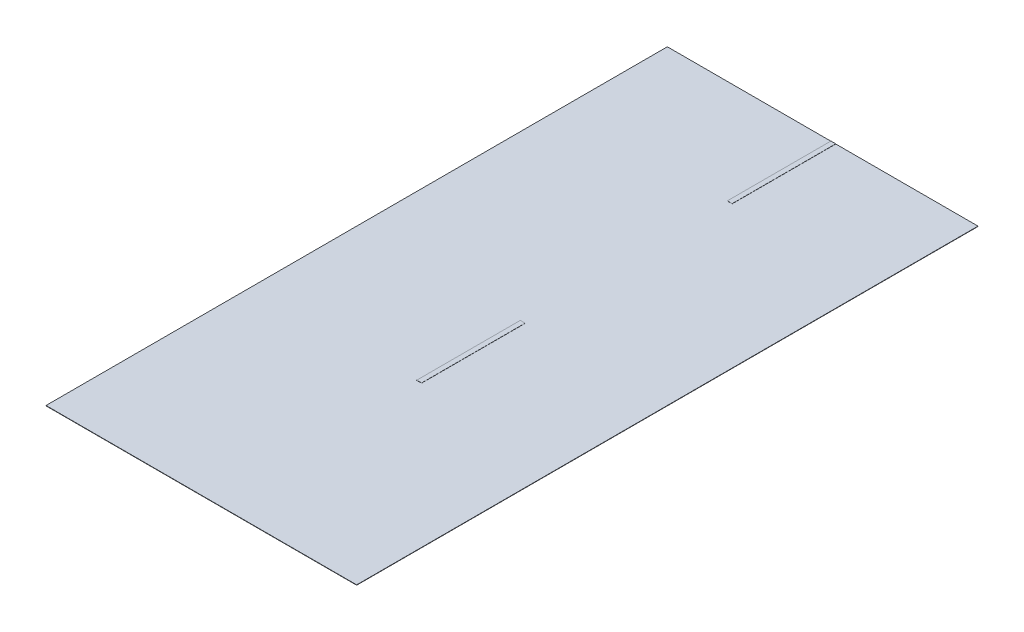
ISO-10303-21;
HEADER;
FILE_DESCRIPTION(('STEP AP214'),'2;1');
FILE_NAME('part.step','',(''),(''),'','','');
FILE_SCHEMA(('AUTOMOTIVE_DESIGN { 1 0 10303 214 1 1 1 1 }'));
ENDSEC;
DATA;
#1=APPLICATION_CONTEXT('core data for automotive mechanical design processes');
#2=APPLICATION_PROTOCOL_DEFINITION('international standard','automotive_design',2000,#1);
#3=PRODUCT_CONTEXT('',#1,'mechanical');
#4=PRODUCT('Part','Part','',(#3));
#5=PRODUCT_RELATED_PRODUCT_CATEGORY('part','',(#4));
#6=PRODUCT_DEFINITION_FORMATION('','',#4);
#7=PRODUCT_DEFINITION_CONTEXT('part definition',#1,'design');
#8=PRODUCT_DEFINITION('design','',#6,#7);
#9=PRODUCT_DEFINITION_SHAPE('','',#8);
#10=(LENGTH_UNIT() NAMED_UNIT(*) SI_UNIT(.MILLI.,.METRE.));
#11=(NAMED_UNIT(*) PLANE_ANGLE_UNIT() SI_UNIT($,.RADIAN.));
#12=(NAMED_UNIT(*) SI_UNIT($,.STERADIAN.) SOLID_ANGLE_UNIT());
#13=UNCERTAINTY_MEASURE_WITH_UNIT(LENGTH_MEASURE(1.E-05),#10,'distance_accuracy_value','');
#14=(GEOMETRIC_REPRESENTATION_CONTEXT(3) GLOBAL_UNCERTAINTY_ASSIGNED_CONTEXT((#13)) GLOBAL_UNIT_ASSIGNED_CONTEXT((#10,
#11,#12)) REPRESENTATION_CONTEXT('',''));
#15=CARTESIAN_POINT('',(0.,0.,0.));
#16=DIRECTION('',(0.,0.,1.));
#17=DIRECTION('',(1.,0.,0.));
#18=AXIS2_PLACEMENT_3D('',#15,#16,#17);
#19=CARTESIAN_POINT('',(-4572.,10.,18288.));
#20=DIRECTION('',(0.,0.,-1.));
#21=DIRECTION('',(-1.,0.,0.));
#22=AXIS2_PLACEMENT_3D('',#19,#20,#21);
#23=PLANE('',#22);
#24=DIRECTION('',(1.,0.,0.));
#25=VECTOR('',#24,1.);
#26=CARTESIAN_POINT('',(-4572.,0.,18288.));
#27=LINE('',#26,#25);
#28=CARTESIAN_POINT('',(-4572.,0.,18288.));
#29=VERTEX_POINT('',#28);
#30=CARTESIAN_POINT('',(4572.,0.,18288.));
#31=VERTEX_POINT('',#30);
#32=EDGE_CURVE('E143',#29,#31,#27,.T.);
#33=ORIENTED_EDGE('',*,*,#32,.T.);
#34=DIRECTION('',(0.,-1.,0.));
#35=VECTOR('',#34,1.);
#36=CARTESIAN_POINT('',(4572.,10.,18288.));
#37=LINE('',#36,#35);
#38=CARTESIAN_POINT('',(4572.,10.,18288.));
#39=VERTEX_POINT('',#38);
#40=EDGE_CURVE('E11',#39,#31,#37,.T.);
#41=ORIENTED_EDGE('',*,*,#40,.F.);
#42=DIRECTION('',(1.,0.,0.));
#43=VECTOR('',#42,1.);
#44=CARTESIAN_POINT('',(-4572.,10.,18288.));
#45=LINE('',#44,#43);
#46=CARTESIAN_POINT('',(-4572.,10.,18288.));
#47=VERTEX_POINT('',#46);
#48=EDGE_CURVE('E204',#47,#39,#45,.T.);
#49=ORIENTED_EDGE('',*,*,#48,.F.);
#50=DIRECTION('',(0.,-1.,0.));
#51=VECTOR('',#50,1.);
#52=CARTESIAN_POINT('',(-4572.,10.,18288.));
#53=LINE('',#52,#51);
#54=EDGE_CURVE('E215',#47,#29,#53,.T.);
#55=ORIENTED_EDGE('',*,*,#54,.T.);
#56=EDGE_LOOP('',(#33,#41,#49,#55));
#57=FACE_BOUND('',#56,.T.);
#58=ADVANCED_FACE('F47',(#57),#23,.F.);
#59=CARTESIAN_POINT('',(4572.,10.,0.));
#60=DIRECTION('',(-1.,0.,0.));
#61=DIRECTION('',(0.,0.,1.));
#62=AXIS2_PLACEMENT_3D('',#59,#60,#61);
#63=PLANE('',#62);
#64=DIRECTION('',(0.,0.,-1.));
#65=VECTOR('',#64,1.);
#66=CARTESIAN_POINT('',(4572.,0.,0.));
#67=LINE('',#66,#65);
#68=CARTESIAN_POINT('',(4572.,0.,0.));
#69=VERTEX_POINT('',#68);
#70=EDGE_CURVE('E218',#31,#69,#67,.T.);
#71=ORIENTED_EDGE('',*,*,#70,.T.);
#72=DIRECTION('',(0.,-1.,0.));
#73=VECTOR('',#72,1.);
#74=CARTESIAN_POINT('',(4572.,10.,0.));
#75=LINE('',#74,#73);
#76=CARTESIAN_POINT('',(4572.,10.,0.));
#77=VERTEX_POINT('',#76);
#78=EDGE_CURVE('E54',#77,#69,#75,.T.);
#79=ORIENTED_EDGE('',*,*,#78,.F.);
#80=DIRECTION('',(0.,0.,-1.));
#81=VECTOR('',#80,1.);
#82=CARTESIAN_POINT('',(4572.,10.,0.));
#83=LINE('',#82,#81);
#84=EDGE_CURVE('E207',#39,#77,#83,.T.);
#85=ORIENTED_EDGE('',*,*,#84,.F.);
#86=ORIENTED_EDGE('',*,*,#40,.T.);
#87=EDGE_LOOP('',(#71,#79,#85,#86));
#88=FACE_BOUND('',#87,.T.);
#89=ADVANCED_FACE('F271',(#88),#63,.F.);
#90=CARTESIAN_POINT('',(-4572.,10.,0.));
#91=DIRECTION('',(0.,0.,1.));
#92=DIRECTION('',(1.,0.,0.));
#93=AXIS2_PLACEMENT_3D('',#90,#91,#92);
#94=PLANE('',#93);
#95=DIRECTION('',(-1.,0.,0.));
#96=VECTOR('',#95,1.);
#97=CARTESIAN_POINT('',(-4572.,0.,0.));
#98=LINE('',#97,#96);
#99=CARTESIAN_POINT('',(-4572.,0.,0.));
#100=VERTEX_POINT('',#99);
#101=EDGE_CURVE('E220',#69,#100,#98,.T.);
#102=ORIENTED_EDGE('',*,*,#101,.T.);
#103=DIRECTION('',(0.,-1.,0.));
#104=VECTOR('',#103,1.);
#105=CARTESIAN_POINT('',(-4572.,10.,0.));
#106=LINE('',#105,#104);
#107=CARTESIAN_POINT('',(-4572.,10.,0.));
#108=VERTEX_POINT('',#107);
#109=EDGE_CURVE('E225',#108,#100,#106,.T.);
#110=ORIENTED_EDGE('',*,*,#109,.F.);
#111=DIRECTION('',(-1.,0.,0.));
#112=VECTOR('',#111,1.);
#113=CARTESIAN_POINT('',(-4572.,10.,0.));
#114=LINE('',#113,#112);
#115=CARTESIAN_POINT('',(243.635612114678,10.,0.));
#116=VERTEX_POINT('',#115);
#117=EDGE_CURVE('E210',#116,#108,#114,.T.);
#118=ORIENTED_EDGE('',*,*,#117,.F.);
#119=DIRECTION('',(0.,-1.,0.));
#120=VECTOR('',#119,1.);
#121=CARTESIAN_POINT('',(243.635612114678,15.,0.));
#122=LINE('',#121,#120);
#123=CARTESIAN_POINT('',(243.635612114678,15.,0.));
#124=VERTEX_POINT('',#123);
#125=EDGE_CURVE('E165',#124,#116,#122,.T.);
#126=ORIENTED_EDGE('',*,*,#125,.F.);
#127=DIRECTION('',(-1.,0.,0.));
#128=VECTOR('',#127,1.);
#129=CARTESIAN_POINT('',(0.,15.,0.));
#130=LINE('',#129,#128);
#131=CARTESIAN_POINT('',(386.035612114678,15.,0.));
#132=VERTEX_POINT('',#131);
#133=EDGE_CURVE('E177',#132,#124,#130,.T.);
#134=ORIENTED_EDGE('',*,*,#133,.F.);
#135=DIRECTION('',(0.,-1.,0.));
#136=VECTOR('',#135,1.);
#137=CARTESIAN_POINT('',(386.035612114678,15.,0.));
#138=LINE('',#137,#136);
#139=CARTESIAN_POINT('',(386.035612114679,10.,0.));
#140=VERTEX_POINT('',#139);
#141=EDGE_CURVE('E187',#132,#140,#138,.T.);
#142=ORIENTED_EDGE('',*,*,#141,.T.);
#143=EDGE_CURVE('E211',#77,#140,#114,.T.);
#144=ORIENTED_EDGE('',*,*,#143,.F.);
#145=ORIENTED_EDGE('',*,*,#78,.T.);
#146=EDGE_LOOP('',(#102,#110,#118,#126,#134,#142,#144,#145));
#147=FACE_BOUND('',#146,.T.);
#148=ADVANCED_FACE('F232',(#147),#94,.F.);
#149=CARTESIAN_POINT('',(-4572.,10.,0.));
#150=DIRECTION('',(1.,0.,0.));
#151=DIRECTION('',(0.,0.,-1.));
#152=AXIS2_PLACEMENT_3D('',#149,#150,#151);
#153=PLANE('',#152);
#154=DIRECTION('',(0.,0.,1.));
#155=VECTOR('',#154,1.);
#156=CARTESIAN_POINT('',(-4572.,0.,0.));
#157=LINE('',#156,#155);
#158=EDGE_CURVE('E208',#100,#29,#157,.T.);
#159=ORIENTED_EDGE('',*,*,#158,.T.);
#160=ORIENTED_EDGE('',*,*,#54,.F.);
#161=DIRECTION('',(0.,0.,1.));
#162=VECTOR('',#161,1.);
#163=CARTESIAN_POINT('',(-4572.,10.,0.));
#164=LINE('',#163,#162);
#165=EDGE_CURVE('E213',#108,#47,#164,.T.);
#166=ORIENTED_EDGE('',*,*,#165,.F.);
#167=ORIENTED_EDGE('',*,*,#109,.T.);
#168=EDGE_LOOP('',(#159,#160,#166,#167));
#169=FACE_BOUND('',#168,.T.);
#170=ADVANCED_FACE('F241',(#169),#153,.F.);
#171=CARTESIAN_POINT('',(0.,10.,0.));
#172=DIRECTION('',(0.,-1.,0.));
#173=DIRECTION('',(0.,0.,-1.));
#174=AXIS2_PLACEMENT_3D('',#171,#172,#173);
#175=PLANE('',#174);
#176=DIRECTION('',(1.,0.,0.));
#177=VECTOR('',#176,1.);
#178=CARTESIAN_POINT('',(0.,10.,9144.));
#179=LINE('',#178,#177);
#180=CARTESIAN_POINT('',(243.635612114773,10.,9144.));
#181=VERTEX_POINT('',#180);
#182=CARTESIAN_POINT('',(386.035612114774,10.,9144.));
#183=VERTEX_POINT('',#182);
#184=EDGE_CURVE('E69',#181,#183,#179,.T.);
#185=ORIENTED_EDGE('',*,*,#184,.T.);
#186=DIRECTION('',(0.,0.,1.));
#187=VECTOR('',#186,1.);
#188=CARTESIAN_POINT('',(386.035612114772,10.,0.));
#189=LINE('',#188,#187);
#190=CARTESIAN_POINT('',(386.035612114774,10.,12192.));
#191=VERTEX_POINT('',#190);
#192=EDGE_CURVE('E140',#183,#191,#189,.T.);
#193=ORIENTED_EDGE('',*,*,#192,.T.);
#194=DIRECTION('',(1.,0.,0.));
#195=VECTOR('',#194,1.);
#196=CARTESIAN_POINT('',(0.,10.,12192.));
#197=LINE('',#196,#195);
#198=CARTESIAN_POINT('',(243.635612114774,10.,12192.));
#199=VERTEX_POINT('',#198);
#200=EDGE_CURVE('E153',#199,#191,#197,.T.);
#201=ORIENTED_EDGE('',*,*,#200,.F.);
#202=DIRECTION('',(0.,0.,1.));
#203=VECTOR('',#202,1.);
#204=CARTESIAN_POINT('',(243.635612114772,10.,0.));
#205=LINE('',#204,#203);
#206=EDGE_CURVE('E167',#181,#199,#205,.T.);
#207=ORIENTED_EDGE('',*,*,#206,.F.);
#208=EDGE_LOOP('',(#185,#193,#201,#207));
#209=FACE_BOUND('',#208,.T.);
#210=ORIENTED_EDGE('',*,*,#143,.T.);
#211=DIRECTION('',(0.,0.,1.));
#212=VECTOR('',#211,1.);
#213=CARTESIAN_POINT('',(386.035612114678,10.,0.));
#214=LINE('',#213,#212);
#215=CARTESIAN_POINT('',(386.035612114679,10.,3048.));
#216=VERTEX_POINT('',#215);
#217=EDGE_CURVE('E61',#140,#216,#214,.T.);
#218=ORIENTED_EDGE('',*,*,#217,.T.);
#219=DIRECTION('',(1.,0.,0.));
#220=VECTOR('',#219,1.);
#221=CARTESIAN_POINT('',(0.,10.,3048.));
#222=LINE('',#221,#220);
#223=CARTESIAN_POINT('',(243.635612114678,10.,3048.));
#224=VERTEX_POINT('',#223);
#225=EDGE_CURVE('E191',#224,#216,#222,.T.);
#226=ORIENTED_EDGE('',*,*,#225,.F.);
#227=DIRECTION('',(0.,0.,1.));
#228=VECTOR('',#227,1.);
#229=CARTESIAN_POINT('',(243.635612114678,10.,0.));
#230=LINE('',#229,#228);
#231=EDGE_CURVE('E188',#116,#224,#230,.T.);
#232=ORIENTED_EDGE('',*,*,#231,.F.);
#233=ORIENTED_EDGE('',*,*,#117,.T.);
#234=ORIENTED_EDGE('',*,*,#165,.T.);
#235=ORIENTED_EDGE('',*,*,#48,.T.);
#236=ORIENTED_EDGE('',*,*,#84,.T.);
#237=EDGE_LOOP('',(#210,#218,#226,#232,#233,#234,#235,#236));
#238=FACE_BOUND('',#237,.T.);
#239=ADVANCED_FACE('F246',(#209,#238),#175,.F.);
#240=CARTESIAN_POINT('',(0.,0.,0.));
#241=DIRECTION('',(0.,-1.,0.));
#242=DIRECTION('',(0.,0.,-1.));
#243=AXIS2_PLACEMENT_3D('',#240,#241,#242);
#244=PLANE('',#243);
#245=ORIENTED_EDGE('',*,*,#32,.F.);
#246=ORIENTED_EDGE('',*,*,#158,.F.);
#247=ORIENTED_EDGE('',*,*,#101,.F.);
#248=ORIENTED_EDGE('',*,*,#70,.F.);
#249=EDGE_LOOP('',(#245,#246,#247,#248));
#250=FACE_BOUND('',#249,.T.);
#251=ADVANCED_FACE('F238',(#250),#244,.T.);
#252=CARTESIAN_POINT('',(386.035612114772,15.,0.));
#253=DIRECTION('',(1.,0.,0.));
#254=DIRECTION('',(0.,0.,-1.));
#255=AXIS2_PLACEMENT_3D('',#252,#253,#254);
#256=PLANE('',#255);
#257=ORIENTED_EDGE('',*,*,#192,.F.);
#258=DIRECTION('',(0.,-1.,0.));
#259=VECTOR('',#258,1.);
#260=CARTESIAN_POINT('',(386.035612114774,15.,9144.));
#261=LINE('',#260,#259);
#262=CARTESIAN_POINT('',(386.035612114774,15.,9144.));
#263=VERTEX_POINT('',#262);
#264=EDGE_CURVE('E135',#263,#183,#261,.T.);
#265=ORIENTED_EDGE('',*,*,#264,.F.);
#266=DIRECTION('',(0.,0.,1.));
#267=VECTOR('',#266,1.);
#268=CARTESIAN_POINT('',(386.035612114772,15.,0.));
#269=LINE('',#268,#267);
#270=CARTESIAN_POINT('',(386.035612114774,15.,12192.));
#271=VERTEX_POINT('',#270);
#272=EDGE_CURVE('E139',#263,#271,#269,.T.);
#273=ORIENTED_EDGE('',*,*,#272,.T.);
#274=DIRECTION('',(0.,-1.,0.));
#275=VECTOR('',#274,1.);
#276=CARTESIAN_POINT('',(386.035612114774,15.,12192.));
#277=LINE('',#276,#275);
#278=EDGE_CURVE('E163',#271,#191,#277,.T.);
#279=ORIENTED_EDGE('',*,*,#278,.T.);
#280=EDGE_LOOP('',(#257,#265,#273,#279));
#281=FACE_BOUND('',#280,.T.);
#282=ADVANCED_FACE('F137',(#281),#256,.T.);
#283=CARTESIAN_POINT('',(0.,15.,9144.));
#284=DIRECTION('',(0.,0.,-1.));
#285=DIRECTION('',(-1.,0.,0.));
#286=AXIS2_PLACEMENT_3D('',#283,#284,#285);
#287=PLANE('',#286);
#288=ORIENTED_EDGE('',*,*,#184,.F.);
#289=DIRECTION('',(0.,-1.,0.));
#290=VECTOR('',#289,1.);
#291=CARTESIAN_POINT('',(243.635612114773,15.,9144.));
#292=LINE('',#291,#290);
#293=CARTESIAN_POINT('',(243.635612114773,15.,9144.));
#294=VERTEX_POINT('',#293);
#295=EDGE_CURVE('E144',#294,#181,#292,.T.);
#296=ORIENTED_EDGE('',*,*,#295,.F.);
#297=DIRECTION('',(1.,0.,0.));
#298=VECTOR('',#297,1.);
#299=CARTESIAN_POINT('',(0.,15.,9144.));
#300=LINE('',#299,#298);
#301=EDGE_CURVE('E149',#294,#263,#300,.T.);
#302=ORIENTED_EDGE('',*,*,#301,.T.);
#303=ORIENTED_EDGE('',*,*,#264,.T.);
#304=EDGE_LOOP('',(#288,#296,#302,#303));
#305=FACE_BOUND('',#304,.T.);
#306=ADVANCED_FACE('F155',(#305),#287,.T.);
#307=CARTESIAN_POINT('',(243.635612114772,15.,0.));
#308=DIRECTION('',(1.,0.,0.));
#309=DIRECTION('',(0.,0.,-1.));
#310=AXIS2_PLACEMENT_3D('',#307,#308,#309);
#311=PLANE('',#310);
#312=ORIENTED_EDGE('',*,*,#206,.T.);
#313=DIRECTION('',(0.,-1.,0.));
#314=VECTOR('',#313,1.);
#315=CARTESIAN_POINT('',(243.635612114774,15.,12192.));
#316=LINE('',#315,#314);
#317=CARTESIAN_POINT('',(243.635612114774,15.,12192.));
#318=VERTEX_POINT('',#317);
#319=EDGE_CURVE('E173',#318,#199,#316,.T.);
#320=ORIENTED_EDGE('',*,*,#319,.F.);
#321=DIRECTION('',(0.,0.,1.));
#322=VECTOR('',#321,1.);
#323=CARTESIAN_POINT('',(243.635612114772,15.,0.));
#324=LINE('',#323,#322);
#325=EDGE_CURVE('E158',#294,#318,#324,.T.);
#326=ORIENTED_EDGE('',*,*,#325,.F.);
#327=ORIENTED_EDGE('',*,*,#295,.T.);
#328=EDGE_LOOP('',(#312,#320,#326,#327));
#329=FACE_BOUND('',#328,.T.);
#330=ADVANCED_FACE('F306',(#329),#311,.F.);
#331=CARTESIAN_POINT('',(0.,15.,12192.));
#332=DIRECTION('',(0.,0.,-1.));
#333=DIRECTION('',(-1.,0.,0.));
#334=AXIS2_PLACEMENT_3D('',#331,#332,#333);
#335=PLANE('',#334);
#336=ORIENTED_EDGE('',*,*,#200,.T.);
#337=ORIENTED_EDGE('',*,*,#278,.F.);
#338=DIRECTION('',(1.,0.,0.));
#339=VECTOR('',#338,1.);
#340=CARTESIAN_POINT('',(0.,15.,12192.));
#341=LINE('',#340,#339);
#342=EDGE_CURVE('E151',#318,#271,#341,.T.);
#343=ORIENTED_EDGE('',*,*,#342,.F.);
#344=ORIENTED_EDGE('',*,*,#319,.T.);
#345=EDGE_LOOP('',(#336,#337,#343,#344));
#346=FACE_BOUND('',#345,.T.);
#347=ADVANCED_FACE('F313',(#346),#335,.F.);
#348=CARTESIAN_POINT('',(0.,15.,0.));
#349=DIRECTION('',(0.,1.,0.));
#350=DIRECTION('',(0.,0.,1.));
#351=AXIS2_PLACEMENT_3D('',#348,#349,#350);
#352=PLANE('',#351);
#353=ORIENTED_EDGE('',*,*,#272,.F.);
#354=ORIENTED_EDGE('',*,*,#301,.F.);
#355=ORIENTED_EDGE('',*,*,#325,.T.);
#356=ORIENTED_EDGE('',*,*,#342,.T.);
#357=EDGE_LOOP('',(#353,#354,#355,#356));
#358=FACE_BOUND('',#357,.T.);
#359=ADVANCED_FACE('F148',(#358),#352,.T.);
#360=CARTESIAN_POINT('',(243.635612114678,15.,0.));
#361=DIRECTION('',(1.,0.,0.));
#362=DIRECTION('',(0.,0.,-1.));
#363=AXIS2_PLACEMENT_3D('',#360,#361,#362);
#364=PLANE('',#363);
#365=ORIENTED_EDGE('',*,*,#231,.T.);
#366=DIRECTION('',(0.,-1.,0.));
#367=VECTOR('',#366,1.);
#368=CARTESIAN_POINT('',(243.635612114678,15.,3048.));
#369=LINE('',#368,#367);
#370=CARTESIAN_POINT('',(243.635612114678,15.,3048.));
#371=VERTEX_POINT('',#370);
#372=EDGE_CURVE('E199',#371,#224,#369,.T.);
#373=ORIENTED_EDGE('',*,*,#372,.F.);
#374=DIRECTION('',(0.,0.,1.));
#375=VECTOR('',#374,1.);
#376=CARTESIAN_POINT('',(243.635612114678,15.,0.));
#377=LINE('',#376,#375);
#378=EDGE_CURVE('E180',#124,#371,#377,.T.);
#379=ORIENTED_EDGE('',*,*,#378,.F.);
#380=ORIENTED_EDGE('',*,*,#125,.T.);
#381=EDGE_LOOP('',(#365,#373,#379,#380));
#382=FACE_BOUND('',#381,.T.);
#383=ADVANCED_FACE('F251',(#382),#364,.F.);
#384=CARTESIAN_POINT('',(0.,15.,3048.));
#385=DIRECTION('',(0.,0.,-1.));
#386=DIRECTION('',(-1.,0.,0.));
#387=AXIS2_PLACEMENT_3D('',#384,#385,#386);
#388=PLANE('',#387);
#389=ORIENTED_EDGE('',*,*,#225,.T.);
#390=DIRECTION('',(0.,-1.,0.));
#391=VECTOR('',#390,1.);
#392=CARTESIAN_POINT('',(386.035612114679,15.,3048.));
#393=LINE('',#392,#391);
#394=CARTESIAN_POINT('',(386.035612114679,15.,3048.));
#395=VERTEX_POINT('',#394);
#396=EDGE_CURVE('E197',#395,#216,#393,.T.);
#397=ORIENTED_EDGE('',*,*,#396,.F.);
#398=DIRECTION('',(1.,0.,0.));
#399=VECTOR('',#398,1.);
#400=CARTESIAN_POINT('',(0.,15.,3048.));
#401=LINE('',#400,#399);
#402=EDGE_CURVE('E182',#371,#395,#401,.T.);
#403=ORIENTED_EDGE('',*,*,#402,.F.);
#404=ORIENTED_EDGE('',*,*,#372,.T.);
#405=EDGE_LOOP('',(#389,#397,#403,#404));
#406=FACE_BOUND('',#405,.T.);
#407=ADVANCED_FACE('F261',(#406),#388,.F.);
#408=CARTESIAN_POINT('',(386.035612114678,15.,0.));
#409=DIRECTION('',(1.,0.,0.));
#410=DIRECTION('',(0.,0.,-1.));
#411=AXIS2_PLACEMENT_3D('',#408,#409,#410);
#412=PLANE('',#411);
#413=ORIENTED_EDGE('',*,*,#217,.F.);
#414=ORIENTED_EDGE('',*,*,#141,.F.);
#415=DIRECTION('',(0.,0.,1.));
#416=VECTOR('',#415,1.);
#417=CARTESIAN_POINT('',(386.035612114678,15.,0.));
#418=LINE('',#417,#416);
#419=EDGE_CURVE('E184',#132,#395,#418,.T.);
#420=ORIENTED_EDGE('',*,*,#419,.T.);
#421=ORIENTED_EDGE('',*,*,#396,.T.);
#422=EDGE_LOOP('',(#413,#414,#420,#421));
#423=FACE_BOUND('',#422,.T.);
#424=ADVANCED_FACE('F258',(#423),#412,.T.);
#425=CARTESIAN_POINT('',(0.,15.,0.));
#426=DIRECTION('',(0.,1.,0.));
#427=DIRECTION('',(0.,0.,1.));
#428=AXIS2_PLACEMENT_3D('',#425,#426,#427);
#429=PLANE('',#428);
#430=ORIENTED_EDGE('',*,*,#133,.T.);
#431=ORIENTED_EDGE('',*,*,#378,.T.);
#432=ORIENTED_EDGE('',*,*,#402,.T.);
#433=ORIENTED_EDGE('',*,*,#419,.F.);
#434=EDGE_LOOP('',(#430,#431,#432,#433));
#435=FACE_BOUND('',#434,.T.);
#436=ADVANCED_FACE('F256',(#435),#429,.T.);
#437=CLOSED_SHELL('',(#58,#89,#148,#170,#239,#251,#282,#306,#330,#347,#359,#383,#407,#424,#436));
#438=MANIFOLD_SOLID_BREP('B2',#437);
#439=ADVANCED_BREP_SHAPE_REPRESENTATION('',(#18,#438),#14);
#440=SHAPE_DEFINITION_REPRESENTATION(#9,#439);
ENDSEC;
END-ISO-10303-21;
